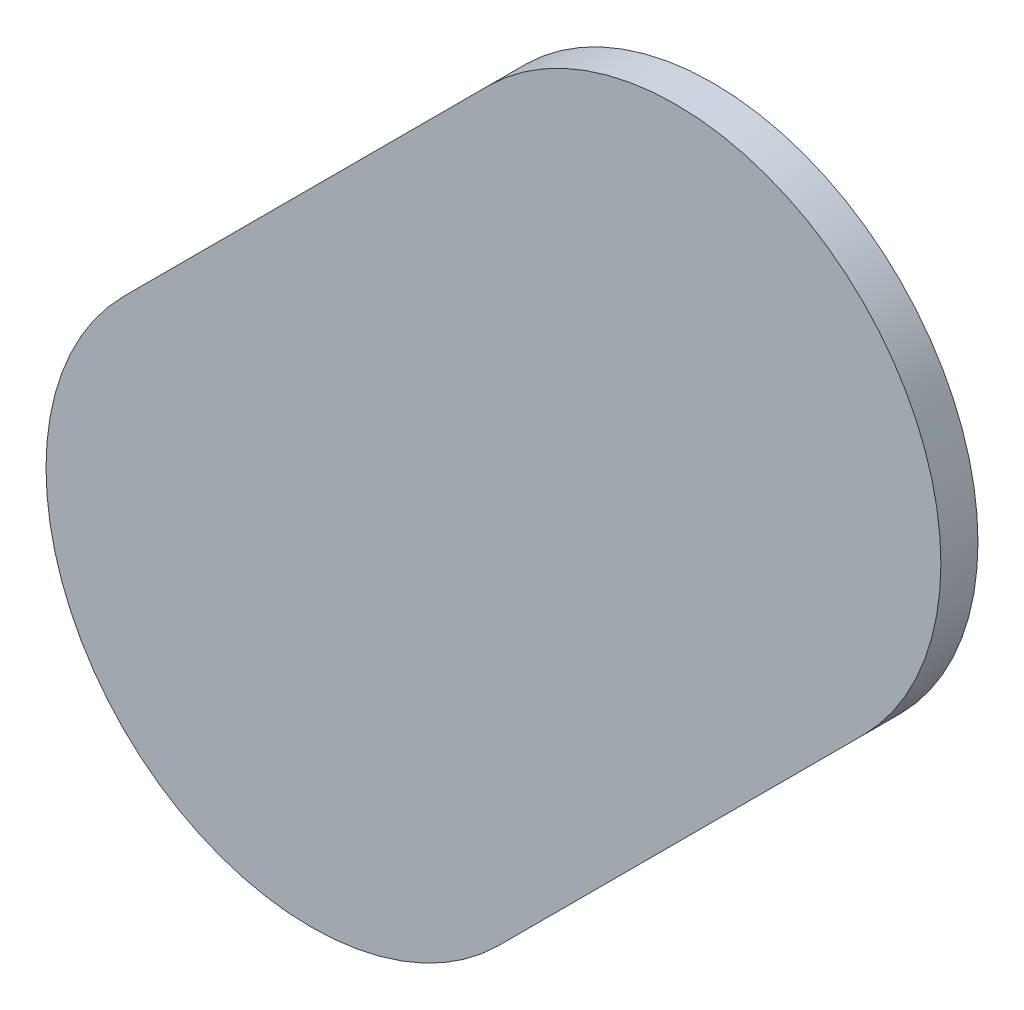
ISO-10303-21;
HEADER;
FILE_DESCRIPTION(('STEP AP214'),'2;1');
FILE_NAME('part.step','',(''),(''),'','','');
FILE_SCHEMA(('AUTOMOTIVE_DESIGN { 1 0 10303 214 1 1 1 1 }'));
ENDSEC;
DATA;
#1=APPLICATION_CONTEXT('core data for automotive mechanical design processes');
#2=APPLICATION_PROTOCOL_DEFINITION('international standard','automotive_design',2000,#1);
#3=PRODUCT_CONTEXT('',#1,'mechanical');
#4=PRODUCT('Part','Part','',(#3));
#5=PRODUCT_RELATED_PRODUCT_CATEGORY('part','',(#4));
#6=PRODUCT_DEFINITION_FORMATION('','',#4);
#7=PRODUCT_DEFINITION_CONTEXT('part definition',#1,'design');
#8=PRODUCT_DEFINITION('design','',#6,#7);
#9=PRODUCT_DEFINITION_SHAPE('','',#8);
#10=(LENGTH_UNIT() NAMED_UNIT(*) SI_UNIT(.MILLI.,.METRE.));
#11=(NAMED_UNIT(*) PLANE_ANGLE_UNIT() SI_UNIT($,.RADIAN.));
#12=(NAMED_UNIT(*) SI_UNIT($,.STERADIAN.) SOLID_ANGLE_UNIT());
#13=UNCERTAINTY_MEASURE_WITH_UNIT(LENGTH_MEASURE(1.E-05),#10,'distance_accuracy_value','');
#14=(GEOMETRIC_REPRESENTATION_CONTEXT(3) GLOBAL_UNCERTAINTY_ASSIGNED_CONTEXT((#13)) GLOBAL_UNIT_ASSIGNED_CONTEXT((#10,
#11,#12)) REPRESENTATION_CONTEXT('',''));
#15=CARTESIAN_POINT('',(0.,0.,0.));
#16=DIRECTION('',(0.,0.,1.));
#17=DIRECTION('',(1.,0.,0.));
#18=AXIS2_PLACEMENT_3D('',#15,#16,#17);
#19=CARTESIAN_POINT('',(99.217223,-100.089223,1.635));
#20=DIRECTION('',(0.,0.,1.));
#21=DIRECTION('',(1.,0.,0.));
#22=AXIS2_PLACEMENT_3D('',#19,#20,#21);
#23=PLANE('',#22);
#24=DIRECTION('',(-0.707106781186548,-0.707106781186548,0.));
#25=VECTOR('',#24,1.);
#26=CARTESIAN_POINT('',(99.217223,-100.089223,1.635));
#27=LINE('',#26,#25);
#28=CARTESIAN_POINT('',(99.217223,-100.089223,1.635));
#29=VERTEX_POINT('',#28);
#30=CARTESIAN_POINT('',(98.873222,-100.433224,1.635));
#31=VERTEX_POINT('',#30);
#32=EDGE_CURVE('E91',#29,#31,#27,.T.);
#33=ORIENTED_EDGE('',*,*,#32,.T.);
#34=CARTESIAN_POINT('',(99.0499985,-100.6100005,1.635));
#35=DIRECTION('',(0.,0.,1.));
#36=DIRECTION('',(-0.707106781186548,0.707106781186548,0.));
#37=AXIS2_PLACEMENT_3D('',#34,#35,#36);
#38=CIRCLE('',#37,0.249999723809);
#39=CARTESIAN_POINT('',(99.226775,-100.786777,1.635));
#40=VERTEX_POINT('',#39);
#41=EDGE_CURVE('E86',#31,#40,#38,.T.);
#42=ORIENTED_EDGE('',*,*,#41,.T.);
#43=DIRECTION('',(0.707106781186548,0.707106781186548,0.));
#44=VECTOR('',#43,1.);
#45=CARTESIAN_POINT('',(99.226775,-100.786777,1.635));
#46=LINE('',#45,#44);
#47=CARTESIAN_POINT('',(99.570776,-100.442776,1.635));
#48=VERTEX_POINT('',#47);
#49=EDGE_CURVE('E105',#40,#48,#46,.T.);
#50=ORIENTED_EDGE('',*,*,#49,.T.);
#51=CARTESIAN_POINT('',(99.3939995,-100.2659995,1.635));
#52=DIRECTION('',(0.,0.,1.));
#53=DIRECTION('',(0.707106781186548,-0.707106781186548,0.));
#54=AXIS2_PLACEMENT_3D('',#51,#52,#53);
#55=CIRCLE('',#54,0.249999723809);
#56=EDGE_CURVE('E11',#48,#29,#55,.T.);
#57=ORIENTED_EDGE('',*,*,#56,.T.);
#58=EDGE_LOOP('',(#33,#42,#50,#57));
#59=FACE_BOUND('',#58,.T.);
#60=ADVANCED_FACE('F17',(#59),#23,.T.);
#61=CARTESIAN_POINT('',(99.217223,-100.089223,1.6));
#62=DIRECTION('',(0.,0.,1.));
#63=DIRECTION('',(1.,0.,0.));
#64=AXIS2_PLACEMENT_3D('',#61,#62,#63);
#65=PLANE('',#64);
#66=CARTESIAN_POINT('',(99.3939995,-100.2659995,1.6));
#67=DIRECTION('',(0.,0.,1.));
#68=DIRECTION('',(0.707106781186548,-0.707106781186548,0.));
#69=AXIS2_PLACEMENT_3D('',#66,#67,#68);
#70=CIRCLE('',#69,0.249999723809);
#71=CARTESIAN_POINT('',(99.570776,-100.442776,1.6));
#72=VERTEX_POINT('',#71);
#73=CARTESIAN_POINT('',(99.217223,-100.089223,1.6));
#74=VERTEX_POINT('',#73);
#75=EDGE_CURVE('E20',#72,#74,#70,.T.);
#76=ORIENTED_EDGE('',*,*,#75,.F.);
#77=DIRECTION('',(0.707106781186548,0.707106781186548,0.));
#78=VECTOR('',#77,1.);
#79=CARTESIAN_POINT('',(99.226775,-100.786777,1.6));
#80=LINE('',#79,#78);
#81=CARTESIAN_POINT('',(99.226775,-100.786777,1.6));
#82=VERTEX_POINT('',#81);
#83=EDGE_CURVE('E74',#82,#72,#80,.T.);
#84=ORIENTED_EDGE('',*,*,#83,.F.);
#85=CARTESIAN_POINT('',(99.0499985,-100.6100005,1.6));
#86=DIRECTION('',(0.,0.,1.));
#87=DIRECTION('',(-0.707106781186548,0.707106781186548,0.));
#88=AXIS2_PLACEMENT_3D('',#85,#86,#87);
#89=CIRCLE('',#88,0.249999723809);
#90=CARTESIAN_POINT('',(98.873222,-100.433224,1.6));
#91=VERTEX_POINT('',#90);
#92=EDGE_CURVE('E68',#91,#82,#89,.T.);
#93=ORIENTED_EDGE('',*,*,#92,.F.);
#94=DIRECTION('',(-0.707106781186548,-0.707106781186548,0.));
#95=VECTOR('',#94,1.);
#96=CARTESIAN_POINT('',(99.217223,-100.089223,1.6));
#97=LINE('',#96,#95);
#98=EDGE_CURVE('E72',#74,#91,#97,.T.);
#99=ORIENTED_EDGE('',*,*,#98,.F.);
#100=EDGE_LOOP('',(#76,#84,#93,#99));
#101=FACE_BOUND('',#100,.T.);
#102=ADVANCED_FACE('F70',(#101),#65,.F.);
#103=CARTESIAN_POINT('',(99.3939995,-100.2659995,1.6));
#104=DIRECTION('',(0.,0.,-1.));
#105=DIRECTION('',(0.707106781186548,-0.707106781186548,0.));
#106=AXIS2_PLACEMENT_3D('',#103,#104,#105);
#107=CYLINDRICAL_SURFACE('',#106,0.249999723809);
#108=ORIENTED_EDGE('',*,*,#75,.T.);
#109=DIRECTION('',(0.,0.,1.));
#110=VECTOR('',#109,1.);
#111=CARTESIAN_POINT('',(99.217223,-100.089223,1.6));
#112=LINE('',#111,#110);
#113=EDGE_CURVE('E80',#74,#29,#112,.T.);
#114=ORIENTED_EDGE('',*,*,#113,.T.);
#115=ORIENTED_EDGE('',*,*,#56,.F.);
#116=DIRECTION('',(0.,0.,1.));
#117=VECTOR('',#116,1.);
#118=CARTESIAN_POINT('',(99.570776,-100.442776,1.6));
#119=LINE('',#118,#117);
#120=EDGE_CURVE('E108',#72,#48,#119,.T.);
#121=ORIENTED_EDGE('',*,*,#120,.F.);
#122=EDGE_LOOP('',(#108,#114,#115,#121));
#123=FACE_BOUND('',#122,.T.);
#124=ADVANCED_FACE('F120',(#123),#107,.T.);
#125=CARTESIAN_POINT('',(99.226775,-100.786777,1.6));
#126=DIRECTION('',(-0.707106781186548,0.707106781186548,0.));
#127=DIRECTION('',(0.,0.,1.));
#128=AXIS2_PLACEMENT_3D('',#125,#126,#127);
#129=PLANE('',#128);
#130=ORIENTED_EDGE('',*,*,#83,.T.);
#131=ORIENTED_EDGE('',*,*,#120,.T.);
#132=ORIENTED_EDGE('',*,*,#49,.F.);
#133=DIRECTION('',(0.,0.,1.));
#134=VECTOR('',#133,1.);
#135=CARTESIAN_POINT('',(99.226775,-100.786777,1.6));
#136=LINE('',#135,#134);
#137=EDGE_CURVE('E79',#82,#40,#136,.T.);
#138=ORIENTED_EDGE('',*,*,#137,.F.);
#139=EDGE_LOOP('',(#130,#131,#132,#138));
#140=FACE_BOUND('',#139,.T.);
#141=ADVANCED_FACE('F119',(#140),#129,.F.);
#142=CARTESIAN_POINT('',(99.0499985,-100.6100005,1.6));
#143=DIRECTION('',(0.,0.,-1.));
#144=DIRECTION('',(-0.707106781186548,0.707106781186548,0.));
#145=AXIS2_PLACEMENT_3D('',#142,#143,#144);
#146=CYLINDRICAL_SURFACE('',#145,0.249999723809);
#147=ORIENTED_EDGE('',*,*,#92,.T.);
#148=ORIENTED_EDGE('',*,*,#137,.T.);
#149=ORIENTED_EDGE('',*,*,#41,.F.);
#150=DIRECTION('',(0.,0.,1.));
#151=VECTOR('',#150,1.);
#152=CARTESIAN_POINT('',(98.873222,-100.433224,1.6));
#153=LINE('',#152,#151);
#154=EDGE_CURVE('E83',#91,#31,#153,.T.);
#155=ORIENTED_EDGE('',*,*,#154,.F.);
#156=EDGE_LOOP('',(#147,#148,#149,#155));
#157=FACE_BOUND('',#156,.T.);
#158=ADVANCED_FACE('F84',(#157),#146,.T.);
#159=CARTESIAN_POINT('',(99.217223,-100.089223,1.6));
#160=DIRECTION('',(0.707106781186548,-0.707106781186548,0.));
#161=DIRECTION('',(0.,0.,-1.));
#162=AXIS2_PLACEMENT_3D('',#159,#160,#161);
#163=PLANE('',#162);
#164=ORIENTED_EDGE('',*,*,#98,.T.);
#165=ORIENTED_EDGE('',*,*,#154,.T.);
#166=ORIENTED_EDGE('',*,*,#32,.F.);
#167=ORIENTED_EDGE('',*,*,#113,.F.);
#168=EDGE_LOOP('',(#164,#165,#166,#167));
#169=FACE_BOUND('',#168,.T.);
#170=ADVANCED_FACE('F94',(#169),#163,.F.);
#171=CLOSED_SHELL('',(#60,#102,#124,#141,#158,#170));
#172=MANIFOLD_SOLID_BREP('B1',#171);
#173=ADVANCED_BREP_SHAPE_REPRESENTATION('',(#18,#172),#14);
#174=SHAPE_DEFINITION_REPRESENTATION(#9,#173);
ENDSEC;
END-ISO-10303-21;
